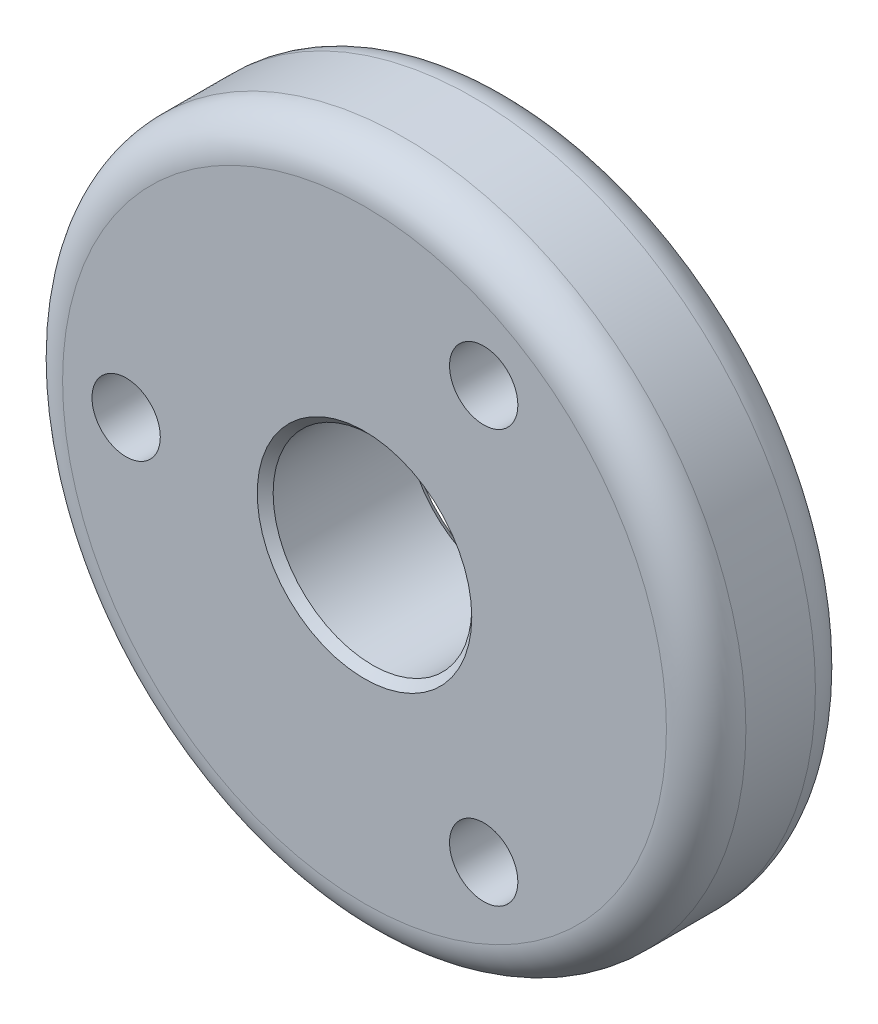
ISO-10303-21;
HEADER;
FILE_DESCRIPTION(('STEP AP214'),'2;1');
FILE_NAME('part.step','',(''),(''),'','','');
FILE_SCHEMA(('AUTOMOTIVE_DESIGN { 1 0 10303 214 1 1 1 1 }'));
ENDSEC;
DATA;
#1=APPLICATION_CONTEXT('core data for automotive mechanical design processes');
#2=APPLICATION_PROTOCOL_DEFINITION('international standard','automotive_design',2000,#1);
#3=PRODUCT_CONTEXT('',#1,'mechanical');
#4=PRODUCT('Part','Part','',(#3));
#5=PRODUCT_RELATED_PRODUCT_CATEGORY('part','',(#4));
#6=PRODUCT_DEFINITION_FORMATION('','',#4);
#7=PRODUCT_DEFINITION_CONTEXT('part definition',#1,'design');
#8=PRODUCT_DEFINITION('design','',#6,#7);
#9=PRODUCT_DEFINITION_SHAPE('','',#8);
#10=(LENGTH_UNIT() NAMED_UNIT(*) SI_UNIT(.MILLI.,.METRE.));
#11=(NAMED_UNIT(*) PLANE_ANGLE_UNIT() SI_UNIT($,.RADIAN.));
#12=(NAMED_UNIT(*) SI_UNIT($,.STERADIAN.) SOLID_ANGLE_UNIT());
#13=UNCERTAINTY_MEASURE_WITH_UNIT(LENGTH_MEASURE(1.E-05),#10,'distance_accuracy_value','');
#14=(GEOMETRIC_REPRESENTATION_CONTEXT(3) GLOBAL_UNCERTAINTY_ASSIGNED_CONTEXT((#13)) GLOBAL_UNIT_ASSIGNED_CONTEXT((#10,
#11,#12)) REPRESENTATION_CONTEXT('',''));
#15=CARTESIAN_POINT('',(0.,0.,0.));
#16=DIRECTION('',(0.,0.,1.));
#17=DIRECTION('',(1.,0.,0.));
#18=AXIS2_PLACEMENT_3D('',#15,#16,#17);
#19=CARTESIAN_POINT('',(0.,0.,1.190625));
#20=DIRECTION('',(0.,0.,1.));
#21=DIRECTION('',(1.,0.,0.));
#22=AXIS2_PLACEMENT_3D('',#19,#20,#21);
#23=PLANE('',#22);
#24=CARTESIAN_POINT('',(1.90500000000002,3.2995567884187,1.190625));
#25=DIRECTION('',(0.,0.,1.));
#26=DIRECTION('',(-0.500000000000004,-0.866025403784436,0.));
#27=AXIS2_PLACEMENT_3D('',#24,#25,#26);
#28=CIRCLE('',#27,0.5461);
#29=CARTESIAN_POINT('',(1.63195000000001,2.82662031541202,1.190625));
#30=VERTEX_POINT('',#29);
#31=EDGE_CURVE('E93',#30,#30,#28,.T.);
#32=ORIENTED_EDGE('',*,*,#31,.F.);
#33=EDGE_LOOP('',(#32));
#34=FACE_BOUND('',#33,.T.);
#35=CARTESIAN_POINT('',(1.90499999999997,-3.29955678841873,1.190625));
#36=DIRECTION('',(0.,0.,1.));
#37=DIRECTION('',(-0.499999999999992,0.866025403784443,0.));
#38=AXIS2_PLACEMENT_3D('',#35,#36,#37);
#39=CIRCLE('',#38,0.5461);
#40=CARTESIAN_POINT('',(1.63194999999997,-2.82662031541204,1.190625));
#41=VERTEX_POINT('',#40);
#42=EDGE_CURVE('E87',#41,#41,#39,.T.);
#43=ORIENTED_EDGE('',*,*,#42,.F.);
#44=EDGE_LOOP('',(#43));
#45=FACE_BOUND('',#44,.T.);
#46=CARTESIAN_POINT('',(-3.81,0.,1.190625));
#47=DIRECTION('',(0.,0.,1.));
#48=DIRECTION('',(1.,0.,0.));
#49=AXIS2_PLACEMENT_3D('',#46,#47,#48);
#50=CIRCLE('',#49,0.5461);
#51=CARTESIAN_POINT('',(-3.2639,0.,1.190625));
#52=VERTEX_POINT('',#51);
#53=EDGE_CURVE('E81',#52,#52,#50,.T.);
#54=ORIENTED_EDGE('',*,*,#53,.F.);
#55=EDGE_LOOP('',(#54));
#56=FACE_BOUND('',#55,.T.);
#57=CARTESIAN_POINT('',(0.,0.,1.190625));
#58=DIRECTION('',(0.,0.,1.));
#59=DIRECTION('',(1.,0.,0.));
#60=AXIS2_PLACEMENT_3D('',#57,#58,#59);
#61=CIRCLE('',#60,1.71450000000001);
#62=CARTESIAN_POINT('',(1.71450000000001,0.,1.190625));
#63=VERTEX_POINT('',#62);
#64=EDGE_CURVE('E10',#63,#63,#61,.F.);
#65=ORIENTED_EDGE('',*,*,#64,.T.);
#66=EDGE_LOOP('',(#65));
#67=FACE_BOUND('',#66,.T.);
#68=CARTESIAN_POINT('',(0.,0.,1.190625));
#69=DIRECTION('',(0.,0.,1.));
#70=DIRECTION('',(1.,0.,0.));
#71=AXIS2_PLACEMENT_3D('',#68,#69,#70);
#72=CIRCLE('',#71,4.826);
#73=CARTESIAN_POINT('',(4.826,0.,1.190625));
#74=VERTEX_POINT('',#73);
#75=EDGE_CURVE('E68',#74,#74,#72,.T.);
#76=ORIENTED_EDGE('',*,*,#75,.T.);
#77=EDGE_LOOP('',(#76));
#78=FACE_BOUND('',#77,.T.);
#79=ADVANCED_FACE('F47',(#34,#45,#56,#67,#78),#23,.T.);
#80=CARTESIAN_POINT('',(0.,0.,-1.190625));
#81=DIRECTION('',(0.,0.,1.));
#82=DIRECTION('',(1.,0.,0.));
#83=AXIS2_PLACEMENT_3D('',#80,#81,#82);
#84=PLANE('',#83);
#85=CARTESIAN_POINT('',(1.90500000000002,3.2995567884187,-1.190625));
#86=DIRECTION('',(0.,0.,1.));
#87=DIRECTION('',(-0.500000000000004,-0.866025403784436,0.));
#88=AXIS2_PLACEMENT_3D('',#85,#86,#87);
#89=CIRCLE('',#88,0.5461);
#90=CARTESIAN_POINT('',(1.63195000000001,2.82662031541202,-1.190625));
#91=VERTEX_POINT('',#90);
#92=EDGE_CURVE('E84',#91,#91,#89,.T.);
#93=ORIENTED_EDGE('',*,*,#92,.T.);
#94=EDGE_LOOP('',(#93));
#95=FACE_BOUND('',#94,.T.);
#96=CARTESIAN_POINT('',(1.90499999999997,-3.29955678841873,-1.190625));
#97=DIRECTION('',(0.,0.,1.));
#98=DIRECTION('',(-0.499999999999992,0.866025403784443,0.));
#99=AXIS2_PLACEMENT_3D('',#96,#97,#98);
#100=CIRCLE('',#99,0.5461);
#101=CARTESIAN_POINT('',(1.63194999999997,-2.82662031541204,-1.190625));
#102=VERTEX_POINT('',#101);
#103=EDGE_CURVE('E90',#102,#102,#100,.T.);
#104=ORIENTED_EDGE('',*,*,#103,.T.);
#105=EDGE_LOOP('',(#104));
#106=FACE_BOUND('',#105,.T.);
#107=CARTESIAN_POINT('',(-3.81,0.,-1.190625));
#108=DIRECTION('',(0.,0.,1.));
#109=DIRECTION('',(1.,0.,0.));
#110=AXIS2_PLACEMENT_3D('',#107,#108,#109);
#111=CIRCLE('',#110,0.5461);
#112=CARTESIAN_POINT('',(-3.2639,0.,-1.190625));
#113=VERTEX_POINT('',#112);
#114=EDGE_CURVE('E80',#113,#113,#111,.T.);
#115=ORIENTED_EDGE('',*,*,#114,.T.);
#116=EDGE_LOOP('',(#115));
#117=FACE_BOUND('',#116,.T.);
#118=CARTESIAN_POINT('',(0.,0.,-1.190625));
#119=DIRECTION('',(0.,0.,1.));
#120=DIRECTION('',(1.,0.,0.));
#121=AXIS2_PLACEMENT_3D('',#118,#119,#120);
#122=CIRCLE('',#121,1.71449999999999);
#123=CARTESIAN_POINT('',(1.71449999999999,0.,-1.190625));
#124=VERTEX_POINT('',#123);
#125=EDGE_CURVE('E63',#124,#124,#122,.T.);
#126=ORIENTED_EDGE('',*,*,#125,.T.);
#127=EDGE_LOOP('',(#126));
#128=FACE_BOUND('',#127,.T.);
#129=CARTESIAN_POINT('',(0.,0.,-1.190625));
#130=DIRECTION('',(0.,0.,1.));
#131=DIRECTION('',(1.,0.,0.));
#132=AXIS2_PLACEMENT_3D('',#129,#130,#131);
#133=CIRCLE('',#132,4.826);
#134=CARTESIAN_POINT('',(4.826,0.,-1.190625));
#135=VERTEX_POINT('',#134);
#136=EDGE_CURVE('E71',#135,#135,#133,.F.);
#137=ORIENTED_EDGE('',*,*,#136,.T.);
#138=EDGE_LOOP('',(#137));
#139=FACE_BOUND('',#138,.T.);
#140=ADVANCED_FACE('F99',(#95,#106,#117,#128,#139),#84,.F.);
#141=CARTESIAN_POINT('',(0.,0.,1.190625));
#142=DIRECTION('',(0.,0.,-1.));
#143=DIRECTION('',(-1.,0.,0.));
#144=AXIS2_PLACEMENT_3D('',#141,#142,#143);
#145=CYLINDRICAL_SURFACE('',#144,5.461);
#146=CARTESIAN_POINT('',(0.,0.,-0.555625));
#147=DIRECTION('',(0.,0.,1.));
#148=DIRECTION('',(1.,0.,0.));
#149=AXIS2_PLACEMENT_3D('',#146,#147,#148);
#150=CIRCLE('',#149,5.461);
#151=CARTESIAN_POINT('',(-5.461,0.,-0.555625));
#152=VERTEX_POINT('',#151);
#153=EDGE_CURVE('E74',#152,#152,#150,.T.);
#154=CARTESIAN_POINT('',(0.,0.,0.555625));
#155=DIRECTION('',(0.,0.,1.));
#156=DIRECTION('',(1.,0.,0.));
#157=AXIS2_PLACEMENT_3D('',#154,#155,#156);
#158=CIRCLE('',#157,5.461);
#159=CARTESIAN_POINT('',(-5.461,0.,0.555625));
#160=VERTEX_POINT('',#159);
#161=EDGE_CURVE('E77',#160,#160,#158,.F.);
#162=CARTESIAN_POINT('',(-5.461,0.,-0.555625));
#163=CARTESIAN_POINT('',(-5.461,0.,-0.544049479166667));
#164=CARTESIAN_POINT('',(-5.461,0.,-0.532473958333333));
#165=CARTESIAN_POINT('',(-5.461,0.,-0.509322916666667));
#166=CARTESIAN_POINT('',(-5.461,0.,-0.497747395833333));
#167=CARTESIAN_POINT('',(-5.461,0.,-0.474596354166667));
#168=CARTESIAN_POINT('',(-5.461,0.,-0.463020833333333));
#169=CARTESIAN_POINT('',(-5.461,0.,-0.439869791666667));
#170=CARTESIAN_POINT('',(-5.461,0.,-0.428294270833333));
#171=CARTESIAN_POINT('',(-5.461,0.,-0.405143229166667));
#172=CARTESIAN_POINT('',(-5.461,0.,-0.393567708333333));
#173=CARTESIAN_POINT('',(-5.461,0.,-0.370416666666667));
#174=CARTESIAN_POINT('',(-5.461,0.,-0.358841145833333));
#175=CARTESIAN_POINT('',(-5.461,0.,-0.335690104166667));
#176=CARTESIAN_POINT('',(-5.461,0.,-0.324114583333333));
#177=CARTESIAN_POINT('',(-5.461,0.,-0.300963541666667));
#178=CARTESIAN_POINT('',(-5.461,0.,-0.289388020833333));
#179=CARTESIAN_POINT('',(-5.461,0.,-0.266236979166667));
#180=CARTESIAN_POINT('',(-5.461,0.,-0.254661458333333));
#181=CARTESIAN_POINT('',(-5.461,0.,-0.231510416666667));
#182=CARTESIAN_POINT('',(-5.461,0.,-0.219934895833333));
#183=CARTESIAN_POINT('',(-5.461,0.,-0.196783854166667));
#184=CARTESIAN_POINT('',(-5.461,0.,-0.185208333333333));
#185=CARTESIAN_POINT('',(-5.461,0.,-0.162057291666667));
#186=CARTESIAN_POINT('',(-5.461,0.,-0.150481770833333));
#187=CARTESIAN_POINT('',(-5.461,0.,-0.127330729166667));
#188=CARTESIAN_POINT('',(-5.461,0.,-0.115755208333333));
#189=CARTESIAN_POINT('',(-5.461,0.,-0.0926041666666666));
#190=CARTESIAN_POINT('',(-5.461,0.,-0.0810286458333333));
#191=CARTESIAN_POINT('',(-5.461,0.,-0.0578776041666667));
#192=CARTESIAN_POINT('',(-5.461,0.,-0.0463020833333334));
#193=CARTESIAN_POINT('',(-5.461,0.,-0.0231510416666667));
#194=CARTESIAN_POINT('',(-5.461,0.,-0.0115755208333333));
#195=CARTESIAN_POINT('',(-5.461,0.,0.0115755208333333));
#196=CARTESIAN_POINT('',(-5.461,0.,0.0231510416666667));
#197=CARTESIAN_POINT('',(-5.461,0.,0.0463020833333334));
#198=CARTESIAN_POINT('',(-5.461,0.,0.0578776041666667));
#199=CARTESIAN_POINT('',(-5.461,0.,0.0810286458333333));
#200=CARTESIAN_POINT('',(-5.461,0.,0.0926041666666666));
#201=CARTESIAN_POINT('',(-5.461,0.,0.115755208333333));
#202=CARTESIAN_POINT('',(-5.461,0.,0.127330729166667));
#203=CARTESIAN_POINT('',(-5.461,0.,0.150481770833333));
#204=CARTESIAN_POINT('',(-5.461,0.,0.162057291666667));
#205=CARTESIAN_POINT('',(-5.461,0.,0.185208333333333));
#206=CARTESIAN_POINT('',(-5.461,0.,0.196783854166667));
#207=CARTESIAN_POINT('',(-5.461,0.,0.219934895833333));
#208=CARTESIAN_POINT('',(-5.461,0.,0.231510416666667));
#209=CARTESIAN_POINT('',(-5.461,0.,0.254661458333333));
#210=CARTESIAN_POINT('',(-5.461,0.,0.266236979166667));
#211=CARTESIAN_POINT('',(-5.461,0.,0.289388020833333));
#212=CARTESIAN_POINT('',(-5.461,0.,0.300963541666667));
#213=CARTESIAN_POINT('',(-5.461,0.,0.324114583333333));
#214=CARTESIAN_POINT('',(-5.461,0.,0.335690104166667));
#215=CARTESIAN_POINT('',(-5.461,0.,0.358841145833333));
#216=CARTESIAN_POINT('',(-5.461,0.,0.370416666666667));
#217=CARTESIAN_POINT('',(-5.461,0.,0.393567708333333));
#218=CARTESIAN_POINT('',(-5.461,0.,0.405143229166667));
#219=CARTESIAN_POINT('',(-5.461,0.,0.428294270833333));
#220=CARTESIAN_POINT('',(-5.461,0.,0.439869791666667));
#221=CARTESIAN_POINT('',(-5.461,0.,0.463020833333333));
#222=CARTESIAN_POINT('',(-5.461,0.,0.474596354166667));
#223=CARTESIAN_POINT('',(-5.461,0.,0.497747395833333));
#224=CARTESIAN_POINT('',(-5.461,0.,0.509322916666667));
#225=CARTESIAN_POINT('',(-5.461,0.,0.532473958333333));
#226=CARTESIAN_POINT('',(-5.461,0.,0.544049479166667));
#227=CARTESIAN_POINT('',(-5.461,0.,0.555625));
#228=B_SPLINE_CURVE_WITH_KNOTS('',3,(#162,#163,#164,#165,#166,#167,#168,#169,#170,#171,#172,
#173,#174,#175,#176,#177,#178,#179,#180,#181,#182,#183,#184,#185,#186,#187,#188,#189,#190,#191,
#192,#193,#194,#195,#196,#197,#198,#199,#200,#201,#202,#203,#204,#205,#206,#207,#208,#209,#210,
#211,#212,#213,#214,#215,#216,#217,#218,#219,#220,#221,#222,#223,#224,#225,#226,#227),
.UNSPECIFIED.,.F.,.F.,(4,2,2,2,2,2,2,2,2,2,2,2,2,2,2,2,2,2,2,2,2,2,2,2,2,2,2,2,2,2,2,2,4),(0.,
0.0347265625,0.0694531250000001,0.1041796875,0.13890625,0.1736328125,0.208359375,0.2430859375,
0.2778125,0.3125390625,0.347265625,0.3819921875,0.41671875,0.4514453125,0.486171875,
0.5208984375,0.555625,0.5903515625,0.625078125,0.6598046875,0.69453125,0.7292578125,0.763984375,
0.7987109375,0.8334375,0.8681640625,0.902890625,0.9376171875,0.97234375,1.0070703125,
1.041796875,1.0765234375,1.11125),.UNSPECIFIED.);
#229=EDGE_CURVE('BSEAM140',#152,#160,#228,.T.);
#230=ORIENTED_EDGE('',*,*,#153,.T.);
#231=ORIENTED_EDGE('',*,*,#161,.T.);
#232=ORIENTED_EDGE('',*,*,#229,.T.);
#233=ORIENTED_EDGE('',*,*,#229,.F.);
#234=EDGE_LOOP('',(#230,#232,#231,#233));
#235=FACE_BOUND('',#234,.T.);
#236=ADVANCED_FACE('F140',(#235),#145,.T.);
#237=CARTESIAN_POINT('',(0.,0.,1.190625));
#238=DIRECTION('',(0.,0.,-1.));
#239=DIRECTION('',(-1.,0.,0.));
#240=AXIS2_PLACEMENT_3D('',#237,#238,#239);
#241=CYLINDRICAL_SURFACE('',#240,1.5875);
#242=CARTESIAN_POINT('',(0.,0.,-1.063625));
#243=DIRECTION('',(0.,0.,1.));
#244=DIRECTION('',(1.,0.,0.));
#245=AXIS2_PLACEMENT_3D('',#242,#243,#244);
#246=CIRCLE('',#245,1.5875);
#247=CARTESIAN_POINT('',(-1.5875,0.,-1.063625));
#248=VERTEX_POINT('',#247);
#249=EDGE_CURVE('E55',#248,#248,#246,.F.);
#250=CARTESIAN_POINT('',(0.,0.,1.06362499999999));
#251=DIRECTION('',(0.,0.,1.));
#252=DIRECTION('',(1.,0.,0.));
#253=AXIS2_PLACEMENT_3D('',#250,#251,#252);
#254=CIRCLE('',#253,1.5875);
#255=CARTESIAN_POINT('',(-1.5875,0.,1.06362499999999));
#256=VERTEX_POINT('',#255);
#257=EDGE_CURVE('E59',#256,#256,#254,.T.);
#258=CARTESIAN_POINT('',(-1.5875,0.,-1.063625));
#259=CARTESIAN_POINT('',(-1.5875,0.,-1.04146614583334));
#260=CARTESIAN_POINT('',(-1.5875,0.,-1.01930729166667));
#261=CARTESIAN_POINT('',(-1.5875,0.,-0.974989583333338));
#262=CARTESIAN_POINT('',(-1.5875,0.,-0.952830729166672));
#263=CARTESIAN_POINT('',(-1.5875,0.,-0.908513020833339));
#264=CARTESIAN_POINT('',(-1.5875,0.,-0.886354166666672));
#265=CARTESIAN_POINT('',(-1.5875,0.,-0.842036458333339));
#266=CARTESIAN_POINT('',(-1.5875,0.,-0.819877604166672));
#267=CARTESIAN_POINT('',(-1.5875,0.,-0.775559895833339));
#268=CARTESIAN_POINT('',(-1.5875,0.,-0.753401041666673));
#269=CARTESIAN_POINT('',(-1.5875,0.,-0.709083333333339));
#270=CARTESIAN_POINT('',(-1.5875,0.,-0.686924479166673));
#271=CARTESIAN_POINT('',(-1.5875,0.,-0.64260677083334));
#272=CARTESIAN_POINT('',(-1.5875,0.,-0.620447916666673));
#273=CARTESIAN_POINT('',(-1.5875,0.,-0.57613020833334));
#274=CARTESIAN_POINT('',(-1.5875,0.,-0.553971354166673));
#275=CARTESIAN_POINT('',(-1.5875,0.,-0.50965364583334));
#276=CARTESIAN_POINT('',(-1.5875,0.,-0.487494791666673));
#277=CARTESIAN_POINT('',(-1.5875,0.,-0.44317708333334));
#278=CARTESIAN_POINT('',(-1.5875,0.,-0.421018229166673));
#279=CARTESIAN_POINT('',(-1.5875,0.,-0.37670052083334));
#280=CARTESIAN_POINT('',(-1.5875,0.,-0.354541666666674));
#281=CARTESIAN_POINT('',(-1.5875,0.,-0.31022395833334));
#282=CARTESIAN_POINT('',(-1.5875,0.,-0.288065104166674));
#283=CARTESIAN_POINT('',(-1.5875,0.,-0.243747395833341));
#284=CARTESIAN_POINT('',(-1.5875,0.,-0.221588541666674));
#285=CARTESIAN_POINT('',(-1.5875,0.,-0.177270833333341));
#286=CARTESIAN_POINT('',(-1.5875,0.,-0.155111979166674));
#287=CARTESIAN_POINT('',(-1.5875,0.,-0.110794270833341));
#288=CARTESIAN_POINT('',(-1.5875,0.,-0.0886354166666745));
#289=CARTESIAN_POINT('',(-1.5875,0.,-0.0443177083333413));
#290=CARTESIAN_POINT('',(-1.5875,0.,-0.0221588541666747));
#291=CARTESIAN_POINT('',(-1.5875,0.,0.0221588541666586));
#292=CARTESIAN_POINT('',(-1.5875,0.,0.0443177083333253));
#293=CARTESIAN_POINT('',(-1.5875,0.,0.0886354166666585));
#294=CARTESIAN_POINT('',(-1.5875,0.,0.110794270833325));
#295=CARTESIAN_POINT('',(-1.5875,0.,0.155111979166658));
#296=CARTESIAN_POINT('',(-1.5875,0.,0.177270833333325));
#297=CARTESIAN_POINT('',(-1.5875,0.,0.221588541666658));
#298=CARTESIAN_POINT('',(-1.5875,0.,0.243747395833325));
#299=CARTESIAN_POINT('',(-1.5875,0.,0.288065104166658));
#300=CARTESIAN_POINT('',(-1.5875,0.,0.310223958333324));
#301=CARTESIAN_POINT('',(-1.5875,0.,0.354541666666658));
#302=CARTESIAN_POINT('',(-1.5875,0.,0.376700520833324));
#303=CARTESIAN_POINT('',(-1.5875,0.,0.421018229166657));
#304=CARTESIAN_POINT('',(-1.5875,0.,0.443177083333324));
#305=CARTESIAN_POINT('',(-1.5875,0.,0.487494791666657));
#306=CARTESIAN_POINT('',(-1.5875,0.,0.509653645833324));
#307=CARTESIAN_POINT('',(-1.5875,0.,0.553971354166657));
#308=CARTESIAN_POINT('',(-1.5875,0.,0.576130208333324));
#309=CARTESIAN_POINT('',(-1.5875,0.,0.620447916666657));
#310=CARTESIAN_POINT('',(-1.5875,0.,0.642606770833324));
#311=CARTESIAN_POINT('',(-1.5875,0.,0.686924479166657));
#312=CARTESIAN_POINT('',(-1.5875,0.,0.709083333333323));
#313=CARTESIAN_POINT('',(-1.5875,0.,0.753401041666656));
#314=CARTESIAN_POINT('',(-1.5875,0.,0.775559895833323));
#315=CARTESIAN_POINT('',(-1.5875,0.,0.819877604166656));
#316=CARTESIAN_POINT('',(-1.5875,0.,0.842036458333323));
#317=CARTESIAN_POINT('',(-1.5875,0.,0.886354166666656));
#318=CARTESIAN_POINT('',(-1.5875,0.,0.908513020833323));
#319=CARTESIAN_POINT('',(-1.5875,0.,0.952830729166656));
#320=CARTESIAN_POINT('',(-1.5875,0.,0.974989583333322));
#321=CARTESIAN_POINT('',(-1.5875,0.,1.01930729166666));
#322=CARTESIAN_POINT('',(-1.5875,0.,1.04146614583332));
#323=CARTESIAN_POINT('',(-1.5875,0.,1.06362499999999));
#324=B_SPLINE_CURVE_WITH_KNOTS('',3,(#258,#259,#260,#261,#262,#263,#264,#265,#266,#267,#268,
#269,#270,#271,#272,#273,#274,#275,#276,#277,#278,#279,#280,#281,#282,#283,#284,#285,#286,#287,
#288,#289,#290,#291,#292,#293,#294,#295,#296,#297,#298,#299,#300,#301,#302,#303,#304,#305,#306,
#307,#308,#309,#310,#311,#312,#313,#314,#315,#316,#317,#318,#319,#320,#321,#322,#323),
.UNSPECIFIED.,.F.,.F.,(4,2,2,2,2,2,2,2,2,2,2,2,2,2,2,2,2,2,2,2,2,2,2,2,2,2,2,2,2,2,2,2,4),(0.,
0.0664765624999999,0.132953125,0.199429687499999,0.265906249999999,0.332382812499999,
0.398859374999999,0.465335937499999,0.531812499999998,0.598289062499998,0.664765624999998,
0.731242187499998,0.797718749999998,0.864195312499997,0.930671874999997,0.997148437499997,
1.063625,1.1301015625,1.196578125,1.2630546875,1.32953125,1.3960078125,1.462484375,1.5289609375,
1.5954375,1.6619140625,1.728390625,1.79486718749999,1.86134374999999,1.92782031249999,
1.99429687499999,2.06077343749999,2.12724999999999),.UNSPECIFIED.);
#325=EDGE_CURVE('BSEAM130',#248,#256,#324,.T.);
#326=ORIENTED_EDGE('',*,*,#249,.T.);
#327=ORIENTED_EDGE('',*,*,#257,.T.);
#328=ORIENTED_EDGE('',*,*,#325,.T.);
#329=ORIENTED_EDGE('',*,*,#325,.F.);
#330=EDGE_LOOP('',(#326,#328,#327,#329));
#331=FACE_BOUND('',#330,.T.);
#332=ADVANCED_FACE('F130',(#331),#241,.F.);
#333=CARTESIAN_POINT('',(0.,0.,-0.555625));
#334=DIRECTION('',(0.,0.,1.));
#335=DIRECTION('',(1.,0.,0.));
#336=AXIS2_PLACEMENT_3D('',#333,#334,#335);
#337=TOROIDAL_SURFACE('',#336,4.826,0.635);
#338=ORIENTED_EDGE('',*,*,#136,.F.);
#339=EDGE_LOOP('',(#338));
#340=FACE_BOUND('',#339,.T.);
#341=ORIENTED_EDGE('',*,*,#153,.F.);
#342=EDGE_LOOP('',(#341));
#343=FACE_BOUND('',#342,.T.);
#344=ADVANCED_FACE('F121',(#340,#343),#337,.T.);
#345=CARTESIAN_POINT('',(0.,0.,0.555625));
#346=DIRECTION('',(0.,0.,1.));
#347=DIRECTION('',(1.,0.,0.));
#348=AXIS2_PLACEMENT_3D('',#345,#346,#347);
#349=TOROIDAL_SURFACE('',#348,4.826,0.635);
#350=ORIENTED_EDGE('',*,*,#161,.F.);
#351=EDGE_LOOP('',(#350));
#352=FACE_BOUND('',#351,.T.);
#353=ORIENTED_EDGE('',*,*,#75,.F.);
#354=EDGE_LOOP('',(#353));
#355=FACE_BOUND('',#354,.T.);
#356=ADVANCED_FACE('F118',(#352,#355),#349,.T.);
#357=CARTESIAN_POINT('',(0.,0.,-1.190625));
#358=DIRECTION('',(0.,0.,-1.));
#359=DIRECTION('',(-1.,0.,0.));
#360=AXIS2_PLACEMENT_3D('',#357,#358,#359);
#361=CONICAL_SURFACE('',#360,1.71449999999999,0.785398163397442);
#362=ORIENTED_EDGE('',*,*,#249,.F.);
#363=EDGE_LOOP('',(#362));
#364=FACE_BOUND('',#363,.T.);
#365=ORIENTED_EDGE('',*,*,#125,.F.);
#366=EDGE_LOOP('',(#365));
#367=FACE_BOUND('',#366,.T.);
#368=ADVANCED_FACE('F120',(#364,#367),#361,.F.);
#369=CARTESIAN_POINT('',(0.,0.,1.06362499999999));
#370=DIRECTION('',(0.,0.,1.));
#371=DIRECTION('',(1.,0.,0.));
#372=AXIS2_PLACEMENT_3D('',#369,#370,#371);
#373=CONICAL_SURFACE('',#372,1.5875,0.785398163397447);
#374=ORIENTED_EDGE('',*,*,#64,.F.);
#375=EDGE_LOOP('',(#374));
#376=FACE_BOUND('',#375,.T.);
#377=ORIENTED_EDGE('',*,*,#257,.F.);
#378=EDGE_LOOP('',(#377));
#379=FACE_BOUND('',#378,.T.);
#380=ADVANCED_FACE('F50',(#376,#379),#373,.F.);
#381=CARTESIAN_POINT('',(-3.81,0.,-1.190625));
#382=DIRECTION('',(0.,0.,1.));
#383=DIRECTION('',(1.,0.,0.));
#384=AXIS2_PLACEMENT_3D('',#381,#382,#383);
#385=CYLINDRICAL_SURFACE('',#384,0.5461);
#386=ORIENTED_EDGE('',*,*,#114,.F.);
#387=EDGE_LOOP('',(#386));
#388=FACE_BOUND('',#387,.T.);
#389=ORIENTED_EDGE('',*,*,#53,.T.);
#390=EDGE_LOOP('',(#389));
#391=FACE_BOUND('',#390,.T.);
#392=ADVANCED_FACE('F147',(#388,#391),#385,.F.);
#393=CARTESIAN_POINT('',(1.90499999999997,-3.29955678841873,-1.190625));
#394=DIRECTION('',(0.,0.,1.));
#395=DIRECTION('',(1.,0.,0.));
#396=AXIS2_PLACEMENT_3D('',#393,#394,#395);
#397=CYLINDRICAL_SURFACE('',#396,0.5461);
#398=ORIENTED_EDGE('',*,*,#103,.F.);
#399=EDGE_LOOP('',(#398));
#400=FACE_BOUND('',#399,.T.);
#401=ORIENTED_EDGE('',*,*,#42,.T.);
#402=EDGE_LOOP('',(#401));
#403=FACE_BOUND('',#402,.T.);
#404=ADVANCED_FACE('F105',(#400,#403),#397,.F.);
#405=CARTESIAN_POINT('',(1.90500000000002,3.2995567884187,-1.190625));
#406=DIRECTION('',(0.,0.,1.));
#407=DIRECTION('',(1.,0.,0.));
#408=AXIS2_PLACEMENT_3D('',#405,#406,#407);
#409=CYLINDRICAL_SURFACE('',#408,0.5461);
#410=ORIENTED_EDGE('',*,*,#92,.F.);
#411=EDGE_LOOP('',(#410));
#412=FACE_BOUND('',#411,.T.);
#413=ORIENTED_EDGE('',*,*,#31,.T.);
#414=EDGE_LOOP('',(#413));
#415=FACE_BOUND('',#414,.T.);
#416=ADVANCED_FACE('F102',(#412,#415),#409,.F.);
#417=CLOSED_SHELL('',(#79,#140,#236,#332,#344,#356,#368,#380,#392,#404,#416));
#418=MANIFOLD_SOLID_BREP('B2',#417);
#419=ADVANCED_BREP_SHAPE_REPRESENTATION('',(#18,#418),#14);
#420=SHAPE_DEFINITION_REPRESENTATION(#9,#419);
ENDSEC;
END-ISO-10303-21;
